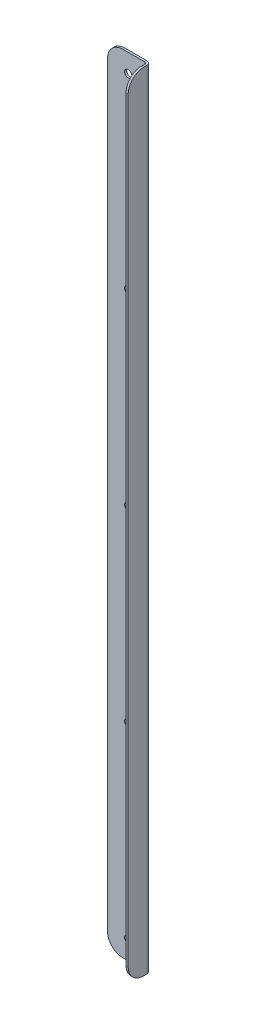
ISO-10303-21;
HEADER;
FILE_DESCRIPTION(('STEP AP214'),'2;1');
FILE_NAME('part.step','',(''),(''),'','','');
FILE_SCHEMA(('AUTOMOTIVE_DESIGN { 1 0 10303 214 1 1 1 1 }'));
ENDSEC;
DATA;
#1=APPLICATION_CONTEXT('core data for automotive mechanical design processes');
#2=APPLICATION_PROTOCOL_DEFINITION('international standard','automotive_design',2000,#1);
#3=PRODUCT_CONTEXT('',#1,'mechanical');
#4=PRODUCT('Part','Part','',(#3));
#5=PRODUCT_RELATED_PRODUCT_CATEGORY('part','',(#4));
#6=PRODUCT_DEFINITION_FORMATION('','',#4);
#7=PRODUCT_DEFINITION_CONTEXT('part definition',#1,'design');
#8=PRODUCT_DEFINITION('design','',#6,#7);
#9=PRODUCT_DEFINITION_SHAPE('','',#8);
#10=(LENGTH_UNIT() NAMED_UNIT(*) SI_UNIT(.MILLI.,.METRE.));
#11=(NAMED_UNIT(*) PLANE_ANGLE_UNIT() SI_UNIT($,.RADIAN.));
#12=(NAMED_UNIT(*) SI_UNIT($,.STERADIAN.) SOLID_ANGLE_UNIT());
#13=UNCERTAINTY_MEASURE_WITH_UNIT(LENGTH_MEASURE(1.E-05),#10,'distance_accuracy_value','');
#14=(GEOMETRIC_REPRESENTATION_CONTEXT(3) GLOBAL_UNCERTAINTY_ASSIGNED_CONTEXT((#13)) GLOBAL_UNIT_ASSIGNED_CONTEXT((#10,
#11,#12)) REPRESENTATION_CONTEXT('',''));
#15=CARTESIAN_POINT('',(0.,0.,0.));
#16=DIRECTION('',(0.,0.,1.));
#17=DIRECTION('',(1.,0.,0.));
#18=AXIS2_PLACEMENT_3D('',#15,#16,#17);
#19=CARTESIAN_POINT('',(-20.,380.5,-2.));
#20=DIRECTION('',(0.,1.,0.));
#21=DIRECTION('',(0.,0.,1.));
#22=AXIS2_PLACEMENT_3D('',#19,#20,#21);
#23=PLANE('',#22);
#24=DIRECTION('',(-1.,0.,0.));
#25=VECTOR('',#24,1.);
#26=CARTESIAN_POINT('',(-20.,380.5,-2.));
#27=LINE('',#26,#25);
#28=CARTESIAN_POINT('',(16.,380.5,-1.99999999999998));
#29=VERTEX_POINT('',#28);
#30=CARTESIAN_POINT('',(-5.,380.5,-2.));
#31=VERTEX_POINT('',#30);
#32=EDGE_CURVE('E217',#29,#31,#27,.T.);
#33=ORIENTED_EDGE('',*,*,#32,.T.);
#34=DIRECTION('',(0.,0.,1.));
#35=VECTOR('',#34,1.);
#36=CARTESIAN_POINT('',(-5.,380.5,-2.));
#37=LINE('',#36,#35);
#38=CARTESIAN_POINT('',(-5.,380.5,0.));
#39=VERTEX_POINT('',#38);
#40=EDGE_CURVE('E245',#31,#39,#37,.T.);
#41=ORIENTED_EDGE('',*,*,#40,.T.);
#42=DIRECTION('',(-1.,0.,0.));
#43=VECTOR('',#42,1.);
#44=CARTESIAN_POINT('',(-20.,380.5,0.));
#45=LINE('',#44,#43);
#46=CARTESIAN_POINT('',(16.,380.5,0.));
#47=VERTEX_POINT('',#46);
#48=EDGE_CURVE('E215',#47,#39,#45,.T.);
#49=ORIENTED_EDGE('',*,*,#48,.F.);
#50=DIRECTION('',(0.,0.,-1.));
#51=VECTOR('',#50,1.);
#52=CARTESIAN_POINT('',(16.,380.5,0.));
#53=LINE('',#52,#51);
#54=EDGE_CURVE('E204',#47,#29,#53,.T.);
#55=ORIENTED_EDGE('',*,*,#54,.T.);
#56=EDGE_LOOP('',(#33,#41,#49,#55));
#57=FACE_BOUND('',#56,.T.);
#58=ADVANCED_FACE('F57',(#57),#23,.T.);
#59=CARTESIAN_POINT('',(0.,0.,-2.));
#60=DIRECTION('',(0.,0.,-1.));
#61=DIRECTION('',(-1.,0.,0.));
#62=AXIS2_PLACEMENT_3D('',#59,#60,#61);
#63=PLANE('',#62);
#64=CARTESIAN_POINT('',(0.,362.5,-2.00000000000001));
#65=DIRECTION('',(0.,0.,1.));
#66=DIRECTION('',(1.,0.,0.));
#67=AXIS2_PLACEMENT_3D('',#64,#65,#66);
#68=CIRCLE('',#67,3.5);
#69=CARTESIAN_POINT('',(3.5,362.5,-2.00000000000001));
#70=VERTEX_POINT('',#69);
#71=EDGE_CURVE('E433',#70,#70,#68,.T.);
#72=ORIENTED_EDGE('',*,*,#71,.T.);
#73=EDGE_LOOP('',(#72));
#74=FACE_BOUND('',#73,.T.);
#75=CARTESIAN_POINT('',(0.,181.25,-2.00000000000001));
#76=DIRECTION('',(0.,0.,1.));
#77=DIRECTION('',(1.,0.,0.));
#78=AXIS2_PLACEMENT_3D('',#75,#76,#77);
#79=CIRCLE('',#78,3.5);
#80=CARTESIAN_POINT('',(3.50000000000002,181.25,-2.00000000000001));
#81=VERTEX_POINT('',#80);
#82=EDGE_CURVE('E443',#81,#81,#79,.T.);
#83=ORIENTED_EDGE('',*,*,#82,.T.);
#84=EDGE_LOOP('',(#83));
#85=FACE_BOUND('',#84,.T.);
#86=CARTESIAN_POINT('',(0.,0.,-2.00000000000001));
#87=DIRECTION('',(0.,0.,1.));
#88=DIRECTION('',(1.,0.,0.));
#89=AXIS2_PLACEMENT_3D('',#86,#87,#88);
#90=CIRCLE('',#89,3.5);
#91=CARTESIAN_POINT('',(3.5,0.,-2.00000000000001));
#92=VERTEX_POINT('',#91);
#93=EDGE_CURVE('E449',#92,#92,#90,.T.);
#94=ORIENTED_EDGE('',*,*,#93,.T.);
#95=EDGE_LOOP('',(#94));
#96=FACE_BOUND('',#95,.T.);
#97=CARTESIAN_POINT('',(0.,-181.25,-2.00000000000001));
#98=DIRECTION('',(0.,0.,1.));
#99=DIRECTION('',(1.,0.,0.));
#100=AXIS2_PLACEMENT_3D('',#97,#98,#99);
#101=CIRCLE('',#100,3.5);
#102=CARTESIAN_POINT('',(3.50000000000004,-181.25,-2.00000000000001));
#103=VERTEX_POINT('',#102);
#104=EDGE_CURVE('E455',#103,#103,#101,.T.);
#105=ORIENTED_EDGE('',*,*,#104,.T.);
#106=EDGE_LOOP('',(#105));
#107=FACE_BOUND('',#106,.T.);
#108=CARTESIAN_POINT('',(0.,-362.5,-2.00000000000001));
#109=DIRECTION('',(0.,0.,1.));
#110=DIRECTION('',(1.,0.,0.));
#111=AXIS2_PLACEMENT_3D('',#108,#109,#110);
#112=CIRCLE('',#111,3.5);
#113=CARTESIAN_POINT('',(3.50000000000006,-362.5,-2.00000000000001));
#114=VERTEX_POINT('',#113);
#115=EDGE_CURVE('E201',#114,#114,#112,.T.);
#116=ORIENTED_EDGE('',*,*,#115,.T.);
#117=EDGE_LOOP('',(#116));
#118=FACE_BOUND('',#117,.T.);
#119=DIRECTION('',(0.,-1.,0.));
#120=VECTOR('',#119,1.);
#121=CARTESIAN_POINT('',(-20.,-380.5,-2.));
#122=LINE('',#121,#120);
#123=CARTESIAN_POINT('',(-20.,365.5,-2.));
#124=VERTEX_POINT('',#123);
#125=CARTESIAN_POINT('',(-20.,-365.5,-2.));
#126=VERTEX_POINT('',#125);
#127=EDGE_CURVE('E220',#124,#126,#122,.T.);
#128=ORIENTED_EDGE('',*,*,#127,.F.);
#129=CARTESIAN_POINT('',(-5.,365.5,-2.));
#130=DIRECTION('',(0.,0.,-1.));
#131=DIRECTION('',(-1.,0.,0.));
#132=AXIS2_PLACEMENT_3D('',#129,#130,#131);
#133=CIRCLE('',#132,15.);
#134=EDGE_CURVE('E258',#124,#31,#133,.T.);
#135=ORIENTED_EDGE('',*,*,#134,.T.);
#136=ORIENTED_EDGE('',*,*,#32,.F.);
#137=DIRECTION('',(0.,1.,0.));
#138=VECTOR('',#137,1.);
#139=CARTESIAN_POINT('',(16.,380.5,-1.99999999999998));
#140=LINE('',#139,#138);
#141=CARTESIAN_POINT('',(16.,-380.5,-2.));
#142=VERTEX_POINT('',#141);
#143=EDGE_CURVE('E155',#29,#142,#140,.F.);
#144=ORIENTED_EDGE('',*,*,#143,.T.);
#145=DIRECTION('',(1.,0.,0.));
#146=VECTOR('',#145,1.);
#147=CARTESIAN_POINT('',(-20.,-380.5,-2.));
#148=LINE('',#147,#146);
#149=CARTESIAN_POINT('',(-5.,-380.5,-2.));
#150=VERTEX_POINT('',#149);
#151=EDGE_CURVE('E223',#150,#142,#148,.T.);
#152=ORIENTED_EDGE('',*,*,#151,.F.);
#153=CARTESIAN_POINT('',(-5.,-365.5,-2.));
#154=DIRECTION('',(0.,0.,-1.));
#155=DIRECTION('',(-1.,0.,0.));
#156=AXIS2_PLACEMENT_3D('',#153,#154,#155);
#157=CIRCLE('',#156,15.);
#158=EDGE_CURVE('E78',#150,#126,#157,.T.);
#159=ORIENTED_EDGE('',*,*,#158,.T.);
#160=EDGE_LOOP('',(#128,#135,#136,#144,#152,#159));
#161=FACE_BOUND('',#160,.T.);
#162=ADVANCED_FACE('F261',(#74,#85,#96,#107,#118,#161),#63,.T.);
#163=CARTESIAN_POINT('',(0.,0.,0.));
#164=DIRECTION('',(0.,0.,-1.));
#165=DIRECTION('',(-1.,0.,0.));
#166=AXIS2_PLACEMENT_3D('',#163,#164,#165);
#167=PLANE('',#166);
#168=CARTESIAN_POINT('',(0.,362.5,0.));
#169=DIRECTION('',(0.,0.,1.));
#170=DIRECTION('',(1.,0.,0.));
#171=AXIS2_PLACEMENT_3D('',#168,#169,#170);
#172=CIRCLE('',#171,3.5);
#173=CARTESIAN_POINT('',(3.5,362.5,0.));
#174=VERTEX_POINT('',#173);
#175=EDGE_CURVE('E436',#174,#174,#172,.T.);
#176=ORIENTED_EDGE('',*,*,#175,.F.);
#177=EDGE_LOOP('',(#176));
#178=FACE_BOUND('',#177,.T.);
#179=CARTESIAN_POINT('',(0.,181.25,0.));
#180=DIRECTION('',(0.,0.,1.));
#181=DIRECTION('',(1.,0.,0.));
#182=AXIS2_PLACEMENT_3D('',#179,#180,#181);
#183=CIRCLE('',#182,3.5);
#184=CARTESIAN_POINT('',(3.50000000000002,181.25,0.));
#185=VERTEX_POINT('',#184);
#186=EDGE_CURVE('E438',#185,#185,#183,.T.);
#187=ORIENTED_EDGE('',*,*,#186,.F.);
#188=EDGE_LOOP('',(#187));
#189=FACE_BOUND('',#188,.T.);
#190=CARTESIAN_POINT('',(0.,0.,0.));
#191=DIRECTION('',(0.,0.,1.));
#192=DIRECTION('',(1.,0.,0.));
#193=AXIS2_PLACEMENT_3D('',#190,#191,#192);
#194=CIRCLE('',#193,3.5);
#195=CARTESIAN_POINT('',(3.5,0.,0.));
#196=VERTEX_POINT('',#195);
#197=EDGE_CURVE('E446',#196,#196,#194,.T.);
#198=ORIENTED_EDGE('',*,*,#197,.F.);
#199=EDGE_LOOP('',(#198));
#200=FACE_BOUND('',#199,.T.);
#201=CARTESIAN_POINT('',(0.,-181.25,0.));
#202=DIRECTION('',(0.,0.,1.));
#203=DIRECTION('',(1.,0.,0.));
#204=AXIS2_PLACEMENT_3D('',#201,#202,#203);
#205=CIRCLE('',#204,3.5);
#206=CARTESIAN_POINT('',(3.50000000000004,-181.25,0.));
#207=VERTEX_POINT('',#206);
#208=EDGE_CURVE('E452',#207,#207,#205,.T.);
#209=ORIENTED_EDGE('',*,*,#208,.F.);
#210=EDGE_LOOP('',(#209));
#211=FACE_BOUND('',#210,.T.);
#212=CARTESIAN_POINT('',(0.,-362.5,0.));
#213=DIRECTION('',(0.,0.,1.));
#214=DIRECTION('',(1.,0.,0.));
#215=AXIS2_PLACEMENT_3D('',#212,#213,#214);
#216=CIRCLE('',#215,3.5);
#217=CARTESIAN_POINT('',(3.50000000000006,-362.5,0.));
#218=VERTEX_POINT('',#217);
#219=EDGE_CURVE('E458',#218,#218,#216,.T.);
#220=ORIENTED_EDGE('',*,*,#219,.F.);
#221=EDGE_LOOP('',(#220));
#222=FACE_BOUND('',#221,.T.);
#223=ORIENTED_EDGE('',*,*,#48,.T.);
#224=CARTESIAN_POINT('',(-5.,365.5,0.));
#225=DIRECTION('',(0.,0.,-1.));
#226=DIRECTION('',(-1.,0.,0.));
#227=AXIS2_PLACEMENT_3D('',#224,#225,#226);
#228=CIRCLE('',#227,15.);
#229=CARTESIAN_POINT('',(-20.,365.5,0.));
#230=VERTEX_POINT('',#229);
#231=EDGE_CURVE('E250',#39,#230,#228,.F.);
#232=ORIENTED_EDGE('',*,*,#231,.T.);
#233=DIRECTION('',(0.,-1.,0.));
#234=VECTOR('',#233,1.);
#235=CARTESIAN_POINT('',(-20.,-380.5,0.));
#236=LINE('',#235,#234);
#237=CARTESIAN_POINT('',(-20.,-365.5,0.));
#238=VERTEX_POINT('',#237);
#239=EDGE_CURVE('E228',#230,#238,#236,.T.);
#240=ORIENTED_EDGE('',*,*,#239,.T.);
#241=CARTESIAN_POINT('',(-5.,-365.5,0.));
#242=DIRECTION('',(0.,0.,-1.));
#243=DIRECTION('',(-1.,0.,0.));
#244=AXIS2_PLACEMENT_3D('',#241,#242,#243);
#245=CIRCLE('',#244,15.);
#246=CARTESIAN_POINT('',(-5.,-380.5,0.));
#247=VERTEX_POINT('',#246);
#248=EDGE_CURVE('E248',#238,#247,#245,.F.);
#249=ORIENTED_EDGE('',*,*,#248,.T.);
#250=DIRECTION('',(1.,0.,0.));
#251=VECTOR('',#250,1.);
#252=CARTESIAN_POINT('',(-20.,-380.5,0.));
#253=LINE('',#252,#251);
#254=CARTESIAN_POINT('',(16.,-380.5,0.));
#255=VERTEX_POINT('',#254);
#256=EDGE_CURVE('E221',#247,#255,#253,.T.);
#257=ORIENTED_EDGE('',*,*,#256,.T.);
#258=DIRECTION('',(0.,1.,0.));
#259=VECTOR('',#258,1.);
#260=CARTESIAN_POINT('',(16.,380.5,0.));
#261=LINE('',#260,#259);
#262=EDGE_CURVE('E208',#47,#255,#261,.F.);
#263=ORIENTED_EDGE('',*,*,#262,.F.);
#264=EDGE_LOOP('',(#223,#232,#240,#249,#257,#263));
#265=FACE_BOUND('',#264,.T.);
#266=ADVANCED_FACE('F270',(#178,#189,#200,#211,#222,#265),#167,.F.);
#267=CARTESIAN_POINT('',(-20.,-380.5,-2.));
#268=DIRECTION('',(0.,-1.,0.));
#269=DIRECTION('',(0.,0.,-1.));
#270=AXIS2_PLACEMENT_3D('',#267,#268,#269);
#271=PLANE('',#270);
#272=ORIENTED_EDGE('',*,*,#256,.F.);
#273=DIRECTION('',(0.,0.,1.));
#274=VECTOR('',#273,1.);
#275=CARTESIAN_POINT('',(-5.,-380.5,-2.));
#276=LINE('',#275,#274);
#277=EDGE_CURVE('E65',#247,#150,#276,.F.);
#278=ORIENTED_EDGE('',*,*,#277,.T.);
#279=ORIENTED_EDGE('',*,*,#151,.T.);
#280=DIRECTION('',(0.,0.,-1.));
#281=VECTOR('',#280,1.);
#282=CARTESIAN_POINT('',(16.,-380.5,0.));
#283=LINE('',#282,#281);
#284=EDGE_CURVE('E212',#255,#142,#283,.T.);
#285=ORIENTED_EDGE('',*,*,#284,.F.);
#286=EDGE_LOOP('',(#272,#278,#279,#285));
#287=FACE_BOUND('',#286,.T.);
#288=ADVANCED_FACE('F278',(#287),#271,.T.);
#289=CARTESIAN_POINT('',(-20.,-380.5,-2.));
#290=DIRECTION('',(-1.,0.,0.));
#291=DIRECTION('',(0.,0.,1.));
#292=AXIS2_PLACEMENT_3D('',#289,#290,#291);
#293=PLANE('',#292);
#294=ORIENTED_EDGE('',*,*,#239,.F.);
#295=DIRECTION('',(0.,0.,1.));
#296=VECTOR('',#295,1.);
#297=CARTESIAN_POINT('',(-20.,365.5,-2.));
#298=LINE('',#297,#296);
#299=EDGE_CURVE('E255',#230,#124,#298,.F.);
#300=ORIENTED_EDGE('',*,*,#299,.T.);
#301=ORIENTED_EDGE('',*,*,#127,.T.);
#302=DIRECTION('',(0.,0.,1.));
#303=VECTOR('',#302,1.);
#304=CARTESIAN_POINT('',(-20.,-365.5,-2.));
#305=LINE('',#304,#303);
#306=EDGE_CURVE('E252',#126,#238,#305,.T.);
#307=ORIENTED_EDGE('',*,*,#306,.T.);
#308=EDGE_LOOP('',(#294,#300,#301,#307));
#309=FACE_BOUND('',#308,.T.);
#310=ADVANCED_FACE('F273',(#309),#293,.T.);
#311=CARTESIAN_POINT('',(16.,-380.5,2.00000000000003));
#312=DIRECTION('',(0.,-1.,0.));
#313=DIRECTION('',(0.,0.,-1.));
#314=AXIS2_PLACEMENT_3D('',#311,#312,#313);
#315=PLANE('',#314);
#316=DIRECTION('',(-1.,0.,0.));
#317=VECTOR('',#316,1.);
#318=CARTESIAN_POINT('',(20.,-380.5,1.99999999999998));
#319=LINE('',#318,#317);
#320=CARTESIAN_POINT('',(18.,-380.5,2.00000000000002));
#321=VERTEX_POINT('',#320);
#322=CARTESIAN_POINT('',(20.,-380.5,2.00000000000001));
#323=VERTEX_POINT('',#322);
#324=EDGE_CURVE('E198',#321,#323,#319,.F.);
#325=ORIENTED_EDGE('',*,*,#324,.F.);
#326=CARTESIAN_POINT('',(16.,-380.5,2.00000000000003));
#327=DIRECTION('',(0.,1.,0.));
#328=DIRECTION('',(0.,0.,1.));
#329=AXIS2_PLACEMENT_3D('',#326,#327,#328);
#330=CIRCLE('',#329,2.);
#331=EDGE_CURVE('E158',#255,#321,#330,.F.);
#332=ORIENTED_EDGE('',*,*,#331,.F.);
#333=ORIENTED_EDGE('',*,*,#284,.T.);
#334=CARTESIAN_POINT('',(16.,-380.5,2.00000000000003));
#335=DIRECTION('',(0.,1.,0.));
#336=DIRECTION('',(0.,0.,1.));
#337=AXIS2_PLACEMENT_3D('',#334,#335,#336);
#338=CIRCLE('',#337,4.);
#339=EDGE_CURVE('E203',#142,#323,#338,.F.);
#340=ORIENTED_EDGE('',*,*,#339,.T.);
#341=EDGE_LOOP('',(#325,#332,#333,#340));
#342=FACE_BOUND('',#341,.T.);
#343=ADVANCED_FACE('F282',(#342),#315,.T.);
#344=CARTESIAN_POINT('',(16.,380.5,2.00000000000003));
#345=DIRECTION('',(0.,-1.,0.));
#346=DIRECTION('',(0.,0.,-1.));
#347=AXIS2_PLACEMENT_3D('',#344,#345,#346);
#348=PLANE('',#347);
#349=CARTESIAN_POINT('',(16.,380.5,2.00000000000003));
#350=DIRECTION('',(0.,1.,0.));
#351=DIRECTION('',(0.,0.,1.));
#352=AXIS2_PLACEMENT_3D('',#349,#350,#351);
#353=CIRCLE('',#352,2.);
#354=CARTESIAN_POINT('',(18.,380.5,2.00000000000002));
#355=VERTEX_POINT('',#354);
#356=EDGE_CURVE('E165',#355,#47,#353,.T.);
#357=ORIENTED_EDGE('',*,*,#356,.F.);
#358=DIRECTION('',(-1.,0.,0.));
#359=VECTOR('',#358,1.);
#360=CARTESIAN_POINT('',(18.,380.5,2.00000000000005));
#361=LINE('',#360,#359);
#362=CARTESIAN_POINT('',(20.,380.5,2.00000000000004));
#363=VERTEX_POINT('',#362);
#364=EDGE_CURVE('E162',#355,#363,#361,.F.);
#365=ORIENTED_EDGE('',*,*,#364,.T.);
#366=CARTESIAN_POINT('',(16.,380.5,2.00000000000003));
#367=DIRECTION('',(0.,1.,0.));
#368=DIRECTION('',(0.,0.,1.));
#369=AXIS2_PLACEMENT_3D('',#366,#367,#368);
#370=CIRCLE('',#369,4.);
#371=EDGE_CURVE('E147',#363,#29,#370,.T.);
#372=ORIENTED_EDGE('',*,*,#371,.T.);
#373=ORIENTED_EDGE('',*,*,#54,.F.);
#374=EDGE_LOOP('',(#357,#365,#372,#373));
#375=FACE_BOUND('',#374,.T.);
#376=ADVANCED_FACE('F163',(#375),#348,.F.);
#377=CARTESIAN_POINT('',(16.,380.5,2.00000000000003));
#378=DIRECTION('',(0.,1.,0.));
#379=DIRECTION('',(1.,0.,0.));
#380=AXIS2_PLACEMENT_3D('',#377,#378,#379);
#381=CYLINDRICAL_SURFACE('',#380,4.);
#382=ORIENTED_EDGE('',*,*,#143,.F.);
#383=ORIENTED_EDGE('',*,*,#371,.F.);
#384=DIRECTION('',(0.,1.,0.));
#385=VECTOR('',#384,1.);
#386=CARTESIAN_POINT('',(20.,-380.5,1.99999999999998));
#387=LINE('',#386,#385);
#388=EDGE_CURVE('E152',#363,#323,#387,.F.);
#389=ORIENTED_EDGE('',*,*,#388,.T.);
#390=ORIENTED_EDGE('',*,*,#339,.F.);
#391=EDGE_LOOP('',(#382,#383,#389,#390));
#392=FACE_BOUND('',#391,.T.);
#393=ADVANCED_FACE('F149',(#392),#381,.T.);
#394=CARTESIAN_POINT('',(16.,380.5,2.00000000000003));
#395=DIRECTION('',(0.,1.,0.));
#396=DIRECTION('',(1.,0.,0.));
#397=AXIS2_PLACEMENT_3D('',#394,#395,#396);
#398=CYLINDRICAL_SURFACE('',#397,2.);
#399=ORIENTED_EDGE('',*,*,#262,.T.);
#400=ORIENTED_EDGE('',*,*,#331,.T.);
#401=DIRECTION('',(0.,1.,0.));
#402=VECTOR('',#401,1.);
#403=CARTESIAN_POINT('',(18.,-380.5,1.99999999999999));
#404=LINE('',#403,#402);
#405=EDGE_CURVE('E170',#321,#355,#404,.T.);
#406=ORIENTED_EDGE('',*,*,#405,.T.);
#407=ORIENTED_EDGE('',*,*,#356,.T.);
#408=EDGE_LOOP('',(#399,#400,#406,#407));
#409=FACE_BOUND('',#408,.T.);
#410=ADVANCED_FACE('F285',(#409),#398,.F.);
#411=CARTESIAN_POINT('',(20.,-380.5,0.));
#412=DIRECTION('',(0.,1.,0.));
#413=DIRECTION('',(0.,0.,1.));
#414=AXIS2_PLACEMENT_3D('',#411,#412,#413);
#415=PLANE('',#414);
#416=DIRECTION('',(0.,0.,-1.));
#417=VECTOR('',#416,1.);
#418=CARTESIAN_POINT('',(20.,-380.5,0.));
#419=LINE('',#418,#417);
#420=CARTESIAN_POINT('',(20.,-380.5,4.99999999999998));
#421=VERTEX_POINT('',#420);
#422=EDGE_CURVE('E178',#421,#323,#419,.T.);
#423=ORIENTED_EDGE('',*,*,#422,.F.);
#424=DIRECTION('',(-1.,0.,0.));
#425=VECTOR('',#424,1.);
#426=CARTESIAN_POINT('',(20.,-380.5,4.99999999999998));
#427=LINE('',#426,#425);
#428=CARTESIAN_POINT('',(18.,-380.5,4.99999999999999));
#429=VERTEX_POINT('',#428);
#430=EDGE_CURVE('E13',#421,#429,#427,.T.);
#431=ORIENTED_EDGE('',*,*,#430,.T.);
#432=DIRECTION('',(0.,0.,1.));
#433=VECTOR('',#432,1.);
#434=CARTESIAN_POINT('',(18.,-380.5,0.));
#435=LINE('',#434,#433);
#436=EDGE_CURVE('E179',#429,#321,#435,.F.);
#437=ORIENTED_EDGE('',*,*,#436,.T.);
#438=ORIENTED_EDGE('',*,*,#324,.T.);
#439=EDGE_LOOP('',(#423,#431,#437,#438));
#440=FACE_BOUND('',#439,.T.);
#441=ADVANCED_FACE('F301',(#440),#415,.F.);
#442=CARTESIAN_POINT('',(20.0000000000001,380.5,20.));
#443=DIRECTION('',(0.,-1.,0.));
#444=DIRECTION('',(0.,0.,-1.));
#445=AXIS2_PLACEMENT_3D('',#442,#443,#444);
#446=PLANE('',#445);
#447=DIRECTION('',(0.,0.,-1.));
#448=VECTOR('',#447,1.);
#449=CARTESIAN_POINT('',(18.0000000000001,380.5,20.));
#450=LINE('',#449,#448);
#451=CARTESIAN_POINT('',(18.,380.5,5.00000000000003));
#452=VERTEX_POINT('',#451);
#453=EDGE_CURVE('E194',#355,#452,#450,.F.);
#454=ORIENTED_EDGE('',*,*,#453,.T.);
#455=DIRECTION('',(-1.,0.,0.));
#456=VECTOR('',#455,1.);
#457=CARTESIAN_POINT('',(20.,380.5,5.00000000000002));
#458=LINE('',#457,#456);
#459=CARTESIAN_POINT('',(20.,380.5,5.00000000000002));
#460=VERTEX_POINT('',#459);
#461=EDGE_CURVE('E183',#452,#460,#458,.F.);
#462=ORIENTED_EDGE('',*,*,#461,.T.);
#463=DIRECTION('',(0.,0.,1.));
#464=VECTOR('',#463,1.);
#465=CARTESIAN_POINT('',(20.,380.5,9.79727750457922E-13));
#466=LINE('',#465,#464);
#467=EDGE_CURVE('E175',#363,#460,#466,.T.);
#468=ORIENTED_EDGE('',*,*,#467,.F.);
#469=ORIENTED_EDGE('',*,*,#364,.F.);
#470=EDGE_LOOP('',(#454,#462,#468,#469));
#471=FACE_BOUND('',#470,.T.);
#472=ADVANCED_FACE('F181',(#471),#446,.F.);
#473=CARTESIAN_POINT('',(20.,0.,0.));
#474=DIRECTION('',(-1.,0.,0.));
#475=DIRECTION('',(0.,0.,1.));
#476=AXIS2_PLACEMENT_3D('',#473,#474,#475);
#477=PLANE('',#476);
#478=ORIENTED_EDGE('',*,*,#467,.T.);
#479=CARTESIAN_POINT('',(20.,365.5,4.99999999999998));
#480=DIRECTION('',(-1.,0.,0.));
#481=DIRECTION('',(0.,0.,1.));
#482=AXIS2_PLACEMENT_3D('',#479,#480,#481);
#483=CIRCLE('',#482,15.);
#484=CARTESIAN_POINT('',(20.0000000000001,365.5,20.));
#485=VERTEX_POINT('',#484);
#486=EDGE_CURVE('E243',#460,#485,#483,.F.);
#487=ORIENTED_EDGE('',*,*,#486,.T.);
#488=DIRECTION('',(0.,-1.,0.));
#489=VECTOR('',#488,1.);
#490=CARTESIAN_POINT('',(20.0000000000001,0.,20.));
#491=LINE('',#490,#489);
#492=CARTESIAN_POINT('',(20.0000000000001,-365.5,20.));
#493=VERTEX_POINT('',#492);
#494=EDGE_CURVE('E184',#485,#493,#491,.T.);
#495=ORIENTED_EDGE('',*,*,#494,.T.);
#496=CARTESIAN_POINT('',(20.,-365.5,4.99999999999998));
#497=DIRECTION('',(-1.,0.,0.));
#498=DIRECTION('',(0.,0.,1.));
#499=AXIS2_PLACEMENT_3D('',#496,#497,#498);
#500=CIRCLE('',#499,15.);
#501=EDGE_CURVE('E241',#493,#421,#500,.F.);
#502=ORIENTED_EDGE('',*,*,#501,.T.);
#503=ORIENTED_EDGE('',*,*,#422,.T.);
#504=ORIENTED_EDGE('',*,*,#388,.F.);
#505=EDGE_LOOP('',(#478,#487,#495,#502,#503,#504));
#506=FACE_BOUND('',#505,.T.);
#507=ADVANCED_FACE('F174',(#506),#477,.F.);
#508=CARTESIAN_POINT('',(18.,0.,0.));
#509=DIRECTION('',(-1.,0.,0.));
#510=DIRECTION('',(0.,0.,1.));
#511=AXIS2_PLACEMENT_3D('',#508,#509,#510);
#512=PLANE('',#511);
#513=DIRECTION('',(0.,1.,0.));
#514=VECTOR('',#513,1.);
#515=CARTESIAN_POINT('',(18.0000000000001,-380.5,20.));
#516=LINE('',#515,#514);
#517=CARTESIAN_POINT('',(18.0000000000001,365.5,20.));
#518=VERTEX_POINT('',#517);
#519=CARTESIAN_POINT('',(18.0000000000001,-365.5,20.));
#520=VERTEX_POINT('',#519);
#521=EDGE_CURVE('E188',#518,#520,#516,.F.);
#522=ORIENTED_EDGE('',*,*,#521,.F.);
#523=CARTESIAN_POINT('',(18.,365.5,4.99999999999999));
#524=DIRECTION('',(-1.,0.,0.));
#525=DIRECTION('',(0.,0.,1.));
#526=AXIS2_PLACEMENT_3D('',#523,#524,#525);
#527=CIRCLE('',#526,15.);
#528=EDGE_CURVE('E238',#518,#452,#527,.T.);
#529=ORIENTED_EDGE('',*,*,#528,.T.);
#530=ORIENTED_EDGE('',*,*,#453,.F.);
#531=ORIENTED_EDGE('',*,*,#405,.F.);
#532=ORIENTED_EDGE('',*,*,#436,.F.);
#533=CARTESIAN_POINT('',(18.,-365.5,4.99999999999999));
#534=DIRECTION('',(-1.,0.,0.));
#535=DIRECTION('',(0.,0.,1.));
#536=AXIS2_PLACEMENT_3D('',#533,#534,#535);
#537=CIRCLE('',#536,15.);
#538=EDGE_CURVE('E236',#429,#520,#537,.T.);
#539=ORIENTED_EDGE('',*,*,#538,.T.);
#540=EDGE_LOOP('',(#522,#529,#530,#531,#532,#539));
#541=FACE_BOUND('',#540,.T.);
#542=ADVANCED_FACE('F289',(#541),#512,.T.);
#543=CARTESIAN_POINT('',(20.0000000000001,-380.5,20.));
#544=DIRECTION('',(0.,0.,-1.));
#545=DIRECTION('',(-1.,0.,0.));
#546=AXIS2_PLACEMENT_3D('',#543,#544,#545);
#547=PLANE('',#546);
#548=ORIENTED_EDGE('',*,*,#494,.F.);
#549=DIRECTION('',(-1.,0.,0.));
#550=VECTOR('',#549,1.);
#551=CARTESIAN_POINT('',(20.0000000000001,365.5,20.));
#552=LINE('',#551,#550);
#553=EDGE_CURVE('E233',#485,#518,#552,.T.);
#554=ORIENTED_EDGE('',*,*,#553,.T.);
#555=ORIENTED_EDGE('',*,*,#521,.T.);
#556=DIRECTION('',(-1.,0.,0.));
#557=VECTOR('',#556,1.);
#558=CARTESIAN_POINT('',(20.0000000000001,-365.5,20.));
#559=LINE('',#558,#557);
#560=EDGE_CURVE('E225',#520,#493,#559,.F.);
#561=ORIENTED_EDGE('',*,*,#560,.T.);
#562=EDGE_LOOP('',(#548,#554,#555,#561));
#563=FACE_BOUND('',#562,.T.);
#564=ADVANCED_FACE('F296',(#563),#547,.F.);
#565=CARTESIAN_POINT('',(20.,365.5,4.99999999999998));
#566=DIRECTION('',(-1.,0.,0.));
#567=DIRECTION('',(0.,0.,1.));
#568=AXIS2_PLACEMENT_3D('',#565,#566,#567);
#569=CYLINDRICAL_SURFACE('',#568,15.);
#570=ORIENTED_EDGE('',*,*,#486,.F.);
#571=ORIENTED_EDGE('',*,*,#461,.F.);
#572=ORIENTED_EDGE('',*,*,#528,.F.);
#573=ORIENTED_EDGE('',*,*,#553,.F.);
#574=EDGE_LOOP('',(#570,#571,#572,#573));
#575=FACE_BOUND('',#574,.T.);
#576=ADVANCED_FACE('F291',(#575),#569,.T.);
#577=CARTESIAN_POINT('',(-5.,365.5,-2.));
#578=DIRECTION('',(0.,0.,1.));
#579=DIRECTION('',(1.,0.,0.));
#580=AXIS2_PLACEMENT_3D('',#577,#578,#579);
#581=CYLINDRICAL_SURFACE('',#580,15.);
#582=ORIENTED_EDGE('',*,*,#134,.F.);
#583=ORIENTED_EDGE('',*,*,#299,.F.);
#584=ORIENTED_EDGE('',*,*,#231,.F.);
#585=ORIENTED_EDGE('',*,*,#40,.F.);
#586=EDGE_LOOP('',(#582,#583,#584,#585));
#587=FACE_BOUND('',#586,.T.);
#588=ADVANCED_FACE('F267',(#587),#581,.T.);
#589=CARTESIAN_POINT('',(-5.,-365.5,-2.));
#590=DIRECTION('',(0.,0.,1.));
#591=DIRECTION('',(1.,0.,0.));
#592=AXIS2_PLACEMENT_3D('',#589,#590,#591);
#593=CYLINDRICAL_SURFACE('',#592,15.);
#594=ORIENTED_EDGE('',*,*,#158,.F.);
#595=ORIENTED_EDGE('',*,*,#277,.F.);
#596=ORIENTED_EDGE('',*,*,#248,.F.);
#597=ORIENTED_EDGE('',*,*,#306,.F.);
#598=EDGE_LOOP('',(#594,#595,#596,#597));
#599=FACE_BOUND('',#598,.T.);
#600=ADVANCED_FACE('F276',(#599),#593,.T.);
#601=CARTESIAN_POINT('',(20.,-365.5,4.99999999999998));
#602=DIRECTION('',(-1.,0.,0.));
#603=DIRECTION('',(0.,0.,1.));
#604=AXIS2_PLACEMENT_3D('',#601,#602,#603);
#605=CYLINDRICAL_SURFACE('',#604,15.);
#606=ORIENTED_EDGE('',*,*,#501,.F.);
#607=ORIENTED_EDGE('',*,*,#560,.F.);
#608=ORIENTED_EDGE('',*,*,#538,.F.);
#609=ORIENTED_EDGE('',*,*,#430,.F.);
#610=EDGE_LOOP('',(#606,#607,#608,#609));
#611=FACE_BOUND('',#610,.T.);
#612=ADVANCED_FACE('F59',(#611),#605,.T.);
#613=CARTESIAN_POINT('',(0.,-362.5,0.));
#614=DIRECTION('',(0.,0.,1.));
#615=DIRECTION('',(1.,0.,0.));
#616=AXIS2_PLACEMENT_3D('',#613,#614,#615);
#617=CYLINDRICAL_SURFACE('',#616,3.5);
#618=ORIENTED_EDGE('',*,*,#115,.F.);
#619=EDGE_LOOP('',(#618));
#620=FACE_BOUND('',#619,.T.);
#621=ORIENTED_EDGE('',*,*,#219,.T.);
#622=EDGE_LOOP('',(#621));
#623=FACE_BOUND('',#622,.T.);
#624=ADVANCED_FACE('F328',(#620,#623),#617,.F.);
#625=CARTESIAN_POINT('',(0.,-181.25,0.));
#626=DIRECTION('',(0.,0.,1.));
#627=DIRECTION('',(1.,0.,0.));
#628=AXIS2_PLACEMENT_3D('',#625,#626,#627);
#629=CYLINDRICAL_SURFACE('',#628,3.5);
#630=ORIENTED_EDGE('',*,*,#104,.F.);
#631=EDGE_LOOP('',(#630));
#632=FACE_BOUND('',#631,.T.);
#633=ORIENTED_EDGE('',*,*,#208,.T.);
#634=EDGE_LOOP('',(#633));
#635=FACE_BOUND('',#634,.T.);
#636=ADVANCED_FACE('F332',(#632,#635),#629,.F.);
#637=CARTESIAN_POINT('',(0.,0.,0.));
#638=DIRECTION('',(0.,0.,1.));
#639=DIRECTION('',(1.,0.,0.));
#640=AXIS2_PLACEMENT_3D('',#637,#638,#639);
#641=CYLINDRICAL_SURFACE('',#640,3.5);
#642=ORIENTED_EDGE('',*,*,#93,.F.);
#643=EDGE_LOOP('',(#642));
#644=FACE_BOUND('',#643,.T.);
#645=ORIENTED_EDGE('',*,*,#197,.T.);
#646=EDGE_LOOP('',(#645));
#647=FACE_BOUND('',#646,.T.);
#648=ADVANCED_FACE('F338',(#644,#647),#641,.F.);
#649=CARTESIAN_POINT('',(0.,181.25,0.));
#650=DIRECTION('',(0.,0.,1.));
#651=DIRECTION('',(1.,0.,0.));
#652=AXIS2_PLACEMENT_3D('',#649,#650,#651);
#653=CYLINDRICAL_SURFACE('',#652,3.5);
#654=ORIENTED_EDGE('',*,*,#82,.F.);
#655=EDGE_LOOP('',(#654));
#656=FACE_BOUND('',#655,.T.);
#657=ORIENTED_EDGE('',*,*,#186,.T.);
#658=EDGE_LOOP('',(#657));
#659=FACE_BOUND('',#658,.T.);
#660=ADVANCED_FACE('F407',(#656,#659),#653,.F.);
#661=CARTESIAN_POINT('',(0.,362.5,0.));
#662=DIRECTION('',(0.,0.,1.));
#663=DIRECTION('',(1.,0.,0.));
#664=AXIS2_PLACEMENT_3D('',#661,#662,#663);
#665=CYLINDRICAL_SURFACE('',#664,3.5);
#666=ORIENTED_EDGE('',*,*,#71,.F.);
#667=EDGE_LOOP('',(#666));
#668=FACE_BOUND('',#667,.T.);
#669=ORIENTED_EDGE('',*,*,#175,.T.);
#670=EDGE_LOOP('',(#669));
#671=FACE_BOUND('',#670,.T.);
#672=ADVANCED_FACE('F416',(#668,#671),#665,.F.);
#673=CLOSED_SHELL('',(#58,#162,#266,#288,#310,#343,#376,#393,#410,#441,#472,#507,#542,#564,#576,
#588,#600,#612,#624,#636,#648,#660,#672));
#674=MANIFOLD_SOLID_BREP('B2',#673);
#675=ADVANCED_BREP_SHAPE_REPRESENTATION('',(#18,#674),#14);
#676=SHAPE_DEFINITION_REPRESENTATION(#9,#675);
ENDSEC;
END-ISO-10303-21;
